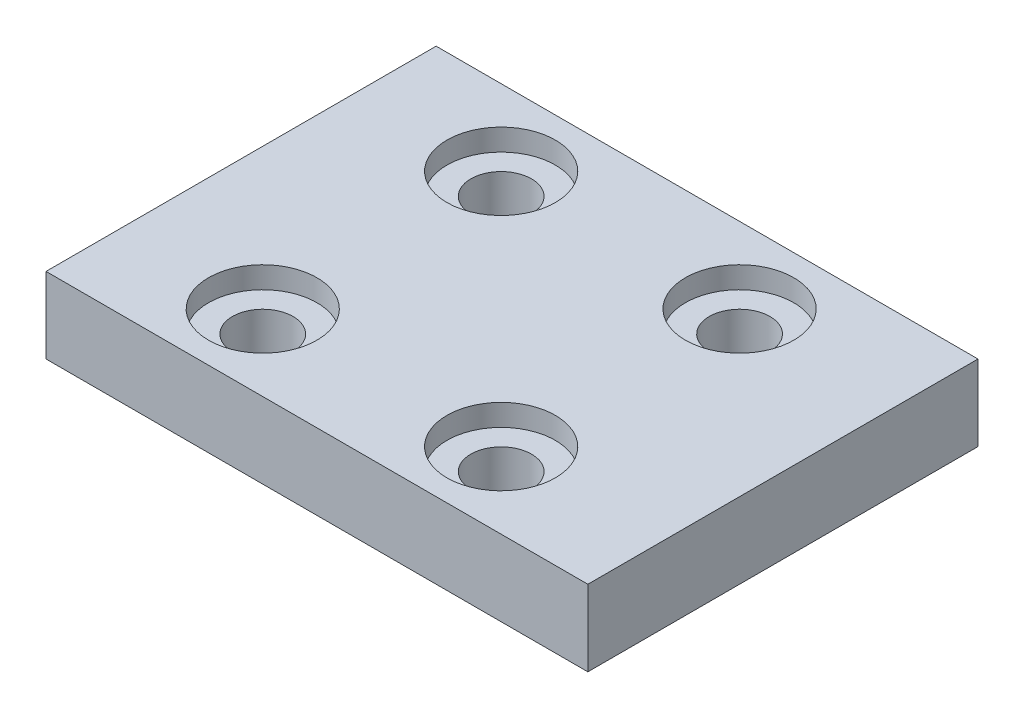
ISO-10303-21;
HEADER;
FILE_DESCRIPTION(('STEP AP214'),'2;1');
FILE_NAME('part.step','',(''),(''),'','','');
FILE_SCHEMA(('AUTOMOTIVE_DESIGN { 1 0 10303 214 1 1 1 1 }'));
ENDSEC;
DATA;
#1=APPLICATION_CONTEXT('core data for automotive mechanical design processes');
#2=APPLICATION_PROTOCOL_DEFINITION('international standard','automotive_design',2000,#1);
#3=PRODUCT_CONTEXT('',#1,'mechanical');
#4=PRODUCT('Part','Part','',(#3));
#5=PRODUCT_RELATED_PRODUCT_CATEGORY('part','',(#4));
#6=PRODUCT_DEFINITION_FORMATION('','',#4);
#7=PRODUCT_DEFINITION_CONTEXT('part definition',#1,'design');
#8=PRODUCT_DEFINITION('design','',#6,#7);
#9=PRODUCT_DEFINITION_SHAPE('','',#8);
#10=(LENGTH_UNIT() NAMED_UNIT(*) SI_UNIT(.MILLI.,.METRE.));
#11=(NAMED_UNIT(*) PLANE_ANGLE_UNIT() SI_UNIT($,.RADIAN.));
#12=(NAMED_UNIT(*) SI_UNIT($,.STERADIAN.) SOLID_ANGLE_UNIT());
#13=UNCERTAINTY_MEASURE_WITH_UNIT(LENGTH_MEASURE(1.E-05),#10,'distance_accuracy_value','');
#14=(GEOMETRIC_REPRESENTATION_CONTEXT(3) GLOBAL_UNCERTAINTY_ASSIGNED_CONTEXT((#13)) GLOBAL_UNIT_ASSIGNED_CONTEXT((#10,
#11,#12)) REPRESENTATION_CONTEXT('',''));
#15=CARTESIAN_POINT('',(0.,0.,0.));
#16=DIRECTION('',(0.,0.,1.));
#17=DIRECTION('',(1.,0.,0.));
#18=AXIS2_PLACEMENT_3D('',#15,#16,#17);
#19=CARTESIAN_POINT('',(13.,0.,-29.));
#20=DIRECTION('',(0.,1.,0.));
#21=DIRECTION('',(0.,0.,1.));
#22=AXIS2_PLACEMENT_3D('',#19,#20,#21);
#23=CYLINDRICAL_SURFACE('',#22,2.80000000000001);
#24=CARTESIAN_POINT('',(13.,0.,-29.));
#25=DIRECTION('',(0.,1.,0.));
#26=DIRECTION('',(0.,0.,1.));
#27=AXIS2_PLACEMENT_3D('',#24,#25,#26);
#28=CIRCLE('',#27,2.80000000000001);
#29=CARTESIAN_POINT('',(13.,0.,-26.2));
#30=VERTEX_POINT('',#29);
#31=EDGE_CURVE('E123',#30,#30,#28,.T.);
#32=ORIENTED_EDGE('',*,*,#31,.F.);
#33=EDGE_LOOP('',(#32));
#34=FACE_BOUND('',#33,.T.);
#35=CARTESIAN_POINT('',(13.,5.,-29.));
#36=DIRECTION('',(0.,1.,0.));
#37=DIRECTION('',(0.,0.,1.));
#38=AXIS2_PLACEMENT_3D('',#35,#36,#37);
#39=CIRCLE('',#38,2.80000000000001);
#40=CARTESIAN_POINT('',(13.,5.,-26.2));
#41=VERTEX_POINT('',#40);
#42=EDGE_CURVE('E51',#41,#41,#39,.F.);
#43=ORIENTED_EDGE('',*,*,#42,.F.);
#44=EDGE_LOOP('',(#43));
#45=FACE_BOUND('',#44,.T.);
#46=ADVANCED_FACE('F47',(#34,#45),#23,.F.);
#47=CARTESIAN_POINT('',(35.,0.,-6.99999999999999));
#48=DIRECTION('',(0.,1.,0.));
#49=DIRECTION('',(0.,0.,1.));
#50=AXIS2_PLACEMENT_3D('',#47,#48,#49);
#51=CYLINDRICAL_SURFACE('',#50,2.8);
#52=CARTESIAN_POINT('',(35.,0.,-6.99999999999999));
#53=DIRECTION('',(0.,1.,0.));
#54=DIRECTION('',(0.,0.,1.));
#55=AXIS2_PLACEMENT_3D('',#52,#53,#54);
#56=CIRCLE('',#55,2.8);
#57=CARTESIAN_POINT('',(35.,0.,-4.19999999999999));
#58=VERTEX_POINT('',#57);
#59=EDGE_CURVE('E149',#58,#58,#56,.T.);
#60=ORIENTED_EDGE('',*,*,#59,.F.);
#61=EDGE_LOOP('',(#60));
#62=FACE_BOUND('',#61,.T.);
#63=CARTESIAN_POINT('',(35.,5.,-6.99999999999999));
#64=DIRECTION('',(0.,1.,0.));
#65=DIRECTION('',(0.,0.,1.));
#66=AXIS2_PLACEMENT_3D('',#63,#64,#65);
#67=CIRCLE('',#66,2.8);
#68=CARTESIAN_POINT('',(35.,5.,-4.19999999999999));
#69=VERTEX_POINT('',#68);
#70=EDGE_CURVE('E142',#69,#69,#67,.F.);
#71=ORIENTED_EDGE('',*,*,#70,.F.);
#72=EDGE_LOOP('',(#71));
#73=FACE_BOUND('',#72,.T.);
#74=ADVANCED_FACE('F179',(#62,#73),#51,.F.);
#75=CARTESIAN_POINT('',(35.,0.,-29.));
#76=DIRECTION('',(0.,1.,0.));
#77=DIRECTION('',(0.,0.,1.));
#78=AXIS2_PLACEMENT_3D('',#75,#76,#77);
#79=CYLINDRICAL_SURFACE('',#78,2.8);
#80=CARTESIAN_POINT('',(35.,0.,-29.));
#81=DIRECTION('',(0.,1.,0.));
#82=DIRECTION('',(0.,0.,1.));
#83=AXIS2_PLACEMENT_3D('',#80,#81,#82);
#84=CIRCLE('',#83,2.8);
#85=CARTESIAN_POINT('',(35.,0.,-26.2));
#86=VERTEX_POINT('',#85);
#87=EDGE_CURVE('E154',#86,#86,#84,.T.);
#88=ORIENTED_EDGE('',*,*,#87,.F.);
#89=EDGE_LOOP('',(#88));
#90=FACE_BOUND('',#89,.T.);
#91=CARTESIAN_POINT('',(35.,5.,-29.));
#92=DIRECTION('',(0.,1.,0.));
#93=DIRECTION('',(0.,0.,1.));
#94=AXIS2_PLACEMENT_3D('',#91,#92,#93);
#95=CIRCLE('',#94,2.8);
#96=CARTESIAN_POINT('',(35.,5.,-26.2));
#97=VERTEX_POINT('',#96);
#98=EDGE_CURVE('E138',#97,#97,#95,.F.);
#99=ORIENTED_EDGE('',*,*,#98,.F.);
#100=EDGE_LOOP('',(#99));
#101=FACE_BOUND('',#100,.T.);
#102=ADVANCED_FACE('F185',(#90,#101),#79,.F.);
#103=CARTESIAN_POINT('',(13.,0.,-6.99999999999999));
#104=DIRECTION('',(0.,1.,0.));
#105=DIRECTION('',(0.,0.,1.));
#106=AXIS2_PLACEMENT_3D('',#103,#104,#105);
#107=CYLINDRICAL_SURFACE('',#106,2.80000000000001);
#108=CARTESIAN_POINT('',(13.,0.,-6.99999999999999));
#109=DIRECTION('',(0.,1.,0.));
#110=DIRECTION('',(0.,0.,-1.));
#111=AXIS2_PLACEMENT_3D('',#108,#109,#110);
#112=CIRCLE('',#111,2.80000000000001);
#113=CARTESIAN_POINT('',(13.,0.,-9.8));
#114=VERTEX_POINT('',#113);
#115=EDGE_CURVE('E160',#114,#114,#112,.T.);
#116=ORIENTED_EDGE('',*,*,#115,.F.);
#117=EDGE_LOOP('',(#116));
#118=FACE_BOUND('',#117,.T.);
#119=CARTESIAN_POINT('',(13.,5.,-6.99999999999999));
#120=DIRECTION('',(0.,1.,0.));
#121=DIRECTION('',(0.,0.,1.));
#122=AXIS2_PLACEMENT_3D('',#119,#120,#121);
#123=CIRCLE('',#122,2.80000000000001);
#124=CARTESIAN_POINT('',(13.,5.,-4.19999999999999));
#125=VERTEX_POINT('',#124);
#126=EDGE_CURVE('E134',#125,#125,#123,.F.);
#127=ORIENTED_EDGE('',*,*,#126,.F.);
#128=EDGE_LOOP('',(#127));
#129=FACE_BOUND('',#128,.T.);
#130=ADVANCED_FACE('F205',(#118,#129),#107,.F.);
#131=CARTESIAN_POINT('',(0.,7.,0.));
#132=DIRECTION('',(1.,0.,0.));
#133=DIRECTION('',(0.,0.,-1.));
#134=AXIS2_PLACEMENT_3D('',#131,#132,#133);
#135=PLANE('',#134);
#136=DIRECTION('',(0.,0.,1.));
#137=VECTOR('',#136,1.);
#138=CARTESIAN_POINT('',(0.,0.,0.));
#139=LINE('',#138,#137);
#140=CARTESIAN_POINT('',(0.,0.,-36.));
#141=VERTEX_POINT('',#140);
#142=CARTESIAN_POINT('',(0.,0.,0.));
#143=VERTEX_POINT('',#142);
#144=EDGE_CURVE('E119',#141,#143,#139,.T.);
#145=ORIENTED_EDGE('',*,*,#144,.T.);
#146=DIRECTION('',(0.,-1.,0.));
#147=VECTOR('',#146,1.);
#148=CARTESIAN_POINT('',(0.,7.,0.));
#149=LINE('',#148,#147);
#150=CARTESIAN_POINT('',(0.,7.,0.));
#151=VERTEX_POINT('',#150);
#152=EDGE_CURVE('E11',#151,#143,#149,.T.);
#153=ORIENTED_EDGE('',*,*,#152,.F.);
#154=DIRECTION('',(0.,0.,1.));
#155=VECTOR('',#154,1.);
#156=CARTESIAN_POINT('',(0.,7.,0.));
#157=LINE('',#156,#155);
#158=CARTESIAN_POINT('',(0.,7.,-36.));
#159=VERTEX_POINT('',#158);
#160=EDGE_CURVE('E102',#159,#151,#157,.T.);
#161=ORIENTED_EDGE('',*,*,#160,.F.);
#162=DIRECTION('',(0.,-1.,0.));
#163=VECTOR('',#162,1.);
#164=CARTESIAN_POINT('',(0.,7.,-36.));
#165=LINE('',#164,#163);
#166=EDGE_CURVE('E115',#159,#141,#165,.T.);
#167=ORIENTED_EDGE('',*,*,#166,.T.);
#168=EDGE_LOOP('',(#145,#153,#161,#167));
#169=FACE_BOUND('',#168,.T.);
#170=ADVANCED_FACE('F49',(#169),#135,.F.);
#171=CARTESIAN_POINT('',(0.,7.,0.));
#172=DIRECTION('',(0.,0.,-1.));
#173=DIRECTION('',(-1.,0.,0.));
#174=AXIS2_PLACEMENT_3D('',#171,#172,#173);
#175=PLANE('',#174);
#176=DIRECTION('',(1.,0.,0.));
#177=VECTOR('',#176,1.);
#178=CARTESIAN_POINT('',(0.,0.,0.));
#179=LINE('',#178,#177);
#180=CARTESIAN_POINT('',(50.,0.,0.));
#181=VERTEX_POINT('',#180);
#182=EDGE_CURVE('E107',#143,#181,#179,.T.);
#183=ORIENTED_EDGE('',*,*,#182,.T.);
#184=DIRECTION('',(0.,-1.,0.));
#185=VECTOR('',#184,1.);
#186=CARTESIAN_POINT('',(50.,7.,0.));
#187=LINE('',#186,#185);
#188=CARTESIAN_POINT('',(50.,7.,0.));
#189=VERTEX_POINT('',#188);
#190=EDGE_CURVE('E58',#189,#181,#187,.T.);
#191=ORIENTED_EDGE('',*,*,#190,.F.);
#192=DIRECTION('',(1.,0.,0.));
#193=VECTOR('',#192,1.);
#194=CARTESIAN_POINT('',(0.,7.,0.));
#195=LINE('',#194,#193);
#196=EDGE_CURVE('E97',#151,#189,#195,.T.);
#197=ORIENTED_EDGE('',*,*,#196,.F.);
#198=ORIENTED_EDGE('',*,*,#152,.T.);
#199=EDGE_LOOP('',(#183,#191,#197,#198));
#200=FACE_BOUND('',#199,.T.);
#201=ADVANCED_FACE('F106',(#200),#175,.F.);
#202=CARTESIAN_POINT('',(50.,7.,0.));
#203=DIRECTION('',(-1.,0.,0.));
#204=DIRECTION('',(0.,0.,1.));
#205=AXIS2_PLACEMENT_3D('',#202,#203,#204);
#206=PLANE('',#205);
#207=DIRECTION('',(0.,0.,-1.));
#208=VECTOR('',#207,1.);
#209=CARTESIAN_POINT('',(50.,0.,0.));
#210=LINE('',#209,#208);
#211=CARTESIAN_POINT('',(50.,0.,-36.));
#212=VERTEX_POINT('',#211);
#213=EDGE_CURVE('E84',#181,#212,#210,.T.);
#214=ORIENTED_EDGE('',*,*,#213,.T.);
#215=DIRECTION('',(0.,-1.,0.));
#216=VECTOR('',#215,1.);
#217=CARTESIAN_POINT('',(50.,7.,-36.));
#218=LINE('',#217,#216);
#219=CARTESIAN_POINT('',(50.,7.,-36.));
#220=VERTEX_POINT('',#219);
#221=EDGE_CURVE('E109',#220,#212,#218,.T.);
#222=ORIENTED_EDGE('',*,*,#221,.F.);
#223=DIRECTION('',(0.,0.,-1.));
#224=VECTOR('',#223,1.);
#225=CARTESIAN_POINT('',(50.,7.,0.));
#226=LINE('',#225,#224);
#227=EDGE_CURVE('E100',#189,#220,#226,.T.);
#228=ORIENTED_EDGE('',*,*,#227,.F.);
#229=ORIENTED_EDGE('',*,*,#190,.T.);
#230=EDGE_LOOP('',(#214,#222,#228,#229));
#231=FACE_BOUND('',#230,.T.);
#232=ADVANCED_FACE('F111',(#231),#206,.F.);
#233=CARTESIAN_POINT('',(0.,7.,-36.));
#234=DIRECTION('',(0.,0.,1.));
#235=DIRECTION('',(1.,0.,0.));
#236=AXIS2_PLACEMENT_3D('',#233,#234,#235);
#237=PLANE('',#236);
#238=DIRECTION('',(-1.,0.,0.));
#239=VECTOR('',#238,1.);
#240=CARTESIAN_POINT('',(0.,0.,-36.));
#241=LINE('',#240,#239);
#242=EDGE_CURVE('E90',#212,#141,#241,.T.);
#243=ORIENTED_EDGE('',*,*,#242,.T.);
#244=ORIENTED_EDGE('',*,*,#166,.F.);
#245=DIRECTION('',(-1.,0.,0.));
#246=VECTOR('',#245,1.);
#247=CARTESIAN_POINT('',(0.,7.,-36.));
#248=LINE('',#247,#246);
#249=EDGE_CURVE('E67',#220,#159,#248,.T.);
#250=ORIENTED_EDGE('',*,*,#249,.F.);
#251=ORIENTED_EDGE('',*,*,#221,.T.);
#252=EDGE_LOOP('',(#243,#244,#250,#251));
#253=FACE_BOUND('',#252,.T.);
#254=ADVANCED_FACE('F193',(#253),#237,.F.);
#255=CARTESIAN_POINT('',(0.,7.,0.));
#256=DIRECTION('',(0.,-1.,0.));
#257=DIRECTION('',(0.,0.,-1.));
#258=AXIS2_PLACEMENT_3D('',#255,#256,#257);
#259=PLANE('',#258);
#260=CARTESIAN_POINT('',(13.,7.,-6.99999999999999));
#261=DIRECTION('',(0.,1.,0.));
#262=DIRECTION('',(0.,0.,1.));
#263=AXIS2_PLACEMENT_3D('',#260,#261,#262);
#264=CIRCLE('',#263,5.);
#265=CARTESIAN_POINT('',(13.,7.,-1.99999999999999));
#266=VERTEX_POINT('',#265);
#267=EDGE_CURVE('E269',#266,#266,#264,.T.);
#268=ORIENTED_EDGE('',*,*,#267,.F.);
#269=EDGE_LOOP('',(#268));
#270=FACE_BOUND('',#269,.T.);
#271=CARTESIAN_POINT('',(35.,7.,-29.));
#272=DIRECTION('',(0.,1.,0.));
#273=DIRECTION('',(0.,0.,1.));
#274=AXIS2_PLACEMENT_3D('',#271,#272,#273);
#275=CIRCLE('',#274,5.);
#276=CARTESIAN_POINT('',(35.,7.,-24.));
#277=VERTEX_POINT('',#276);
#278=EDGE_CURVE('E265',#277,#277,#275,.T.);
#279=ORIENTED_EDGE('',*,*,#278,.F.);
#280=EDGE_LOOP('',(#279));
#281=FACE_BOUND('',#280,.T.);
#282=CARTESIAN_POINT('',(35.,7.,-6.99999999999999));
#283=DIRECTION('',(0.,1.,0.));
#284=DIRECTION('',(0.,0.,1.));
#285=AXIS2_PLACEMENT_3D('',#282,#283,#284);
#286=CIRCLE('',#285,5.);
#287=CARTESIAN_POINT('',(35.,7.,-2.));
#288=VERTEX_POINT('',#287);
#289=EDGE_CURVE('E257',#288,#288,#286,.T.);
#290=ORIENTED_EDGE('',*,*,#289,.F.);
#291=EDGE_LOOP('',(#290));
#292=FACE_BOUND('',#291,.T.);
#293=CARTESIAN_POINT('',(13.,7.,-29.));
#294=DIRECTION('',(0.,1.,0.));
#295=DIRECTION('',(0.,0.,1.));
#296=AXIS2_PLACEMENT_3D('',#293,#294,#295);
#297=CIRCLE('',#296,5.);
#298=CARTESIAN_POINT('',(13.,7.,-24.));
#299=VERTEX_POINT('',#298);
#300=EDGE_CURVE('E164',#299,#299,#297,.T.);
#301=ORIENTED_EDGE('',*,*,#300,.F.);
#302=EDGE_LOOP('',(#301));
#303=FACE_BOUND('',#302,.T.);
#304=ORIENTED_EDGE('',*,*,#160,.T.);
#305=ORIENTED_EDGE('',*,*,#196,.T.);
#306=ORIENTED_EDGE('',*,*,#227,.T.);
#307=ORIENTED_EDGE('',*,*,#249,.T.);
#308=EDGE_LOOP('',(#304,#305,#306,#307));
#309=FACE_BOUND('',#308,.T.);
#310=ADVANCED_FACE('F98',(#270,#281,#292,#303,#309),#259,.F.);
#311=CARTESIAN_POINT('',(0.,0.,0.));
#312=DIRECTION('',(0.,-1.,0.));
#313=DIRECTION('',(0.,0.,-1.));
#314=AXIS2_PLACEMENT_3D('',#311,#312,#313);
#315=PLANE('',#314);
#316=ORIENTED_EDGE('',*,*,#115,.T.);
#317=EDGE_LOOP('',(#316));
#318=FACE_BOUND('',#317,.T.);
#319=ORIENTED_EDGE('',*,*,#87,.T.);
#320=EDGE_LOOP('',(#319));
#321=FACE_BOUND('',#320,.T.);
#322=ORIENTED_EDGE('',*,*,#59,.T.);
#323=EDGE_LOOP('',(#322));
#324=FACE_BOUND('',#323,.T.);
#325=ORIENTED_EDGE('',*,*,#31,.T.);
#326=EDGE_LOOP('',(#325));
#327=FACE_BOUND('',#326,.T.);
#328=ORIENTED_EDGE('',*,*,#144,.F.);
#329=ORIENTED_EDGE('',*,*,#242,.F.);
#330=ORIENTED_EDGE('',*,*,#213,.F.);
#331=ORIENTED_EDGE('',*,*,#182,.F.);
#332=EDGE_LOOP('',(#328,#329,#330,#331));
#333=FACE_BOUND('',#332,.T.);
#334=ADVANCED_FACE('F174',(#318,#321,#324,#327,#333),#315,.T.);
#335=CARTESIAN_POINT('',(13.,5.,-6.99999999999999));
#336=DIRECTION('',(0.,1.,0.));
#337=DIRECTION('',(0.,0.,1.));
#338=AXIS2_PLACEMENT_3D('',#335,#336,#337);
#339=PLANE('',#338);
#340=CARTESIAN_POINT('',(13.,5.,-6.99999999999999));
#341=DIRECTION('',(0.,1.,0.));
#342=DIRECTION('',(0.,0.,1.));
#343=AXIS2_PLACEMENT_3D('',#340,#341,#342);
#344=CIRCLE('',#343,5.);
#345=CARTESIAN_POINT('',(13.,5.,-1.99999999999999));
#346=VERTEX_POINT('',#345);
#347=EDGE_CURVE('E273',#346,#346,#344,.T.);
#348=ORIENTED_EDGE('',*,*,#347,.T.);
#349=EDGE_LOOP('',(#348));
#350=FACE_BOUND('',#349,.T.);
#351=ORIENTED_EDGE('',*,*,#126,.T.);
#352=EDGE_LOOP('',(#351));
#353=FACE_BOUND('',#352,.T.);
#354=ADVANCED_FACE('F196',(#350,#353),#339,.T.);
#355=CARTESIAN_POINT('',(13.,5.,-6.99999999999999));
#356=DIRECTION('',(0.,1.,0.));
#357=DIRECTION('',(0.,0.,1.));
#358=AXIS2_PLACEMENT_3D('',#355,#356,#357);
#359=CYLINDRICAL_SURFACE('',#358,5.);
#360=ORIENTED_EDGE('',*,*,#347,.F.);
#361=EDGE_LOOP('',(#360));
#362=FACE_BOUND('',#361,.T.);
#363=ORIENTED_EDGE('',*,*,#267,.T.);
#364=EDGE_LOOP('',(#363));
#365=FACE_BOUND('',#364,.T.);
#366=ADVANCED_FACE('F232',(#362,#365),#359,.F.);
#367=CARTESIAN_POINT('',(35.,5.,-29.));
#368=DIRECTION('',(0.,1.,0.));
#369=DIRECTION('',(0.,0.,1.));
#370=AXIS2_PLACEMENT_3D('',#367,#368,#369);
#371=PLANE('',#370);
#372=CARTESIAN_POINT('',(35.,5.,-29.));
#373=DIRECTION('',(0.,1.,0.));
#374=DIRECTION('',(0.,0.,1.));
#375=AXIS2_PLACEMENT_3D('',#372,#373,#374);
#376=CIRCLE('',#375,5.);
#377=CARTESIAN_POINT('',(35.,5.,-24.));
#378=VERTEX_POINT('',#377);
#379=EDGE_CURVE('E260',#378,#378,#376,.T.);
#380=ORIENTED_EDGE('',*,*,#379,.T.);
#381=EDGE_LOOP('',(#380));
#382=FACE_BOUND('',#381,.T.);
#383=ORIENTED_EDGE('',*,*,#98,.T.);
#384=EDGE_LOOP('',(#383));
#385=FACE_BOUND('',#384,.T.);
#386=ADVANCED_FACE('F228',(#382,#385),#371,.T.);
#387=CARTESIAN_POINT('',(35.,5.,-29.));
#388=DIRECTION('',(0.,1.,0.));
#389=DIRECTION('',(0.,0.,1.));
#390=AXIS2_PLACEMENT_3D('',#387,#388,#389);
#391=CYLINDRICAL_SURFACE('',#390,5.);
#392=ORIENTED_EDGE('',*,*,#379,.F.);
#393=EDGE_LOOP('',(#392));
#394=FACE_BOUND('',#393,.T.);
#395=ORIENTED_EDGE('',*,*,#278,.T.);
#396=EDGE_LOOP('',(#395));
#397=FACE_BOUND('',#396,.T.);
#398=ADVANCED_FACE('F231',(#394,#397),#391,.F.);
#399=CARTESIAN_POINT('',(35.,5.,-6.99999999999999));
#400=DIRECTION('',(0.,1.,0.));
#401=DIRECTION('',(0.,0.,1.));
#402=AXIS2_PLACEMENT_3D('',#399,#400,#401);
#403=PLANE('',#402);
#404=CARTESIAN_POINT('',(35.,5.,-6.99999999999999));
#405=DIRECTION('',(0.,1.,0.));
#406=DIRECTION('',(0.,0.,1.));
#407=AXIS2_PLACEMENT_3D('',#404,#405,#406);
#408=CIRCLE('',#407,5.);
#409=CARTESIAN_POINT('',(35.,5.,-2.));
#410=VERTEX_POINT('',#409);
#411=EDGE_CURVE('E254',#410,#410,#408,.T.);
#412=ORIENTED_EDGE('',*,*,#411,.T.);
#413=EDGE_LOOP('',(#412));
#414=FACE_BOUND('',#413,.T.);
#415=ORIENTED_EDGE('',*,*,#70,.T.);
#416=EDGE_LOOP('',(#415));
#417=FACE_BOUND('',#416,.T.);
#418=ADVANCED_FACE('F236',(#414,#417),#403,.T.);
#419=CARTESIAN_POINT('',(35.,5.,-6.99999999999999));
#420=DIRECTION('',(0.,1.,0.));
#421=DIRECTION('',(0.,0.,1.));
#422=AXIS2_PLACEMENT_3D('',#419,#420,#421);
#423=CYLINDRICAL_SURFACE('',#422,5.);
#424=ORIENTED_EDGE('',*,*,#411,.F.);
#425=EDGE_LOOP('',(#424));
#426=FACE_BOUND('',#425,.T.);
#427=ORIENTED_EDGE('',*,*,#289,.T.);
#428=EDGE_LOOP('',(#427));
#429=FACE_BOUND('',#428,.T.);
#430=ADVANCED_FACE('F226',(#426,#429),#423,.F.);
#431=CARTESIAN_POINT('',(13.,5.,-29.));
#432=DIRECTION('',(0.,1.,0.));
#433=DIRECTION('',(0.,0.,1.));
#434=AXIS2_PLACEMENT_3D('',#431,#432,#433);
#435=PLANE('',#434);
#436=CARTESIAN_POINT('',(13.,5.,-29.));
#437=DIRECTION('',(0.,1.,0.));
#438=DIRECTION('',(0.,0.,1.));
#439=AXIS2_PLACEMENT_3D('',#436,#437,#438);
#440=CIRCLE('',#439,5.);
#441=CARTESIAN_POINT('',(13.,5.,-24.));
#442=VERTEX_POINT('',#441);
#443=EDGE_CURVE('E139',#442,#442,#440,.T.);
#444=ORIENTED_EDGE('',*,*,#443,.T.);
#445=EDGE_LOOP('',(#444));
#446=FACE_BOUND('',#445,.T.);
#447=ORIENTED_EDGE('',*,*,#42,.T.);
#448=EDGE_LOOP('',(#447));
#449=FACE_BOUND('',#448,.T.);
#450=ADVANCED_FACE('F222',(#446,#449),#435,.T.);
#451=CARTESIAN_POINT('',(13.,5.,-29.));
#452=DIRECTION('',(0.,1.,0.));
#453=DIRECTION('',(0.,0.,1.));
#454=AXIS2_PLACEMENT_3D('',#451,#452,#453);
#455=CYLINDRICAL_SURFACE('',#454,5.);
#456=ORIENTED_EDGE('',*,*,#443,.F.);
#457=EDGE_LOOP('',(#456));
#458=FACE_BOUND('',#457,.T.);
#459=ORIENTED_EDGE('',*,*,#300,.T.);
#460=EDGE_LOOP('',(#459));
#461=FACE_BOUND('',#460,.T.);
#462=ADVANCED_FACE('F219',(#458,#461),#455,.F.);
#463=CLOSED_SHELL('',(#46,#74,#102,#130,#170,#201,#232,#254,#310,#334,#354,#366,#386,#398,#418,
#430,#450,#462));
#464=MANIFOLD_SOLID_BREP('B2',#463);
#465=ADVANCED_BREP_SHAPE_REPRESENTATION('',(#18,#464),#14);
#466=SHAPE_DEFINITION_REPRESENTATION(#9,#465);
ENDSEC;
END-ISO-10303-21;
